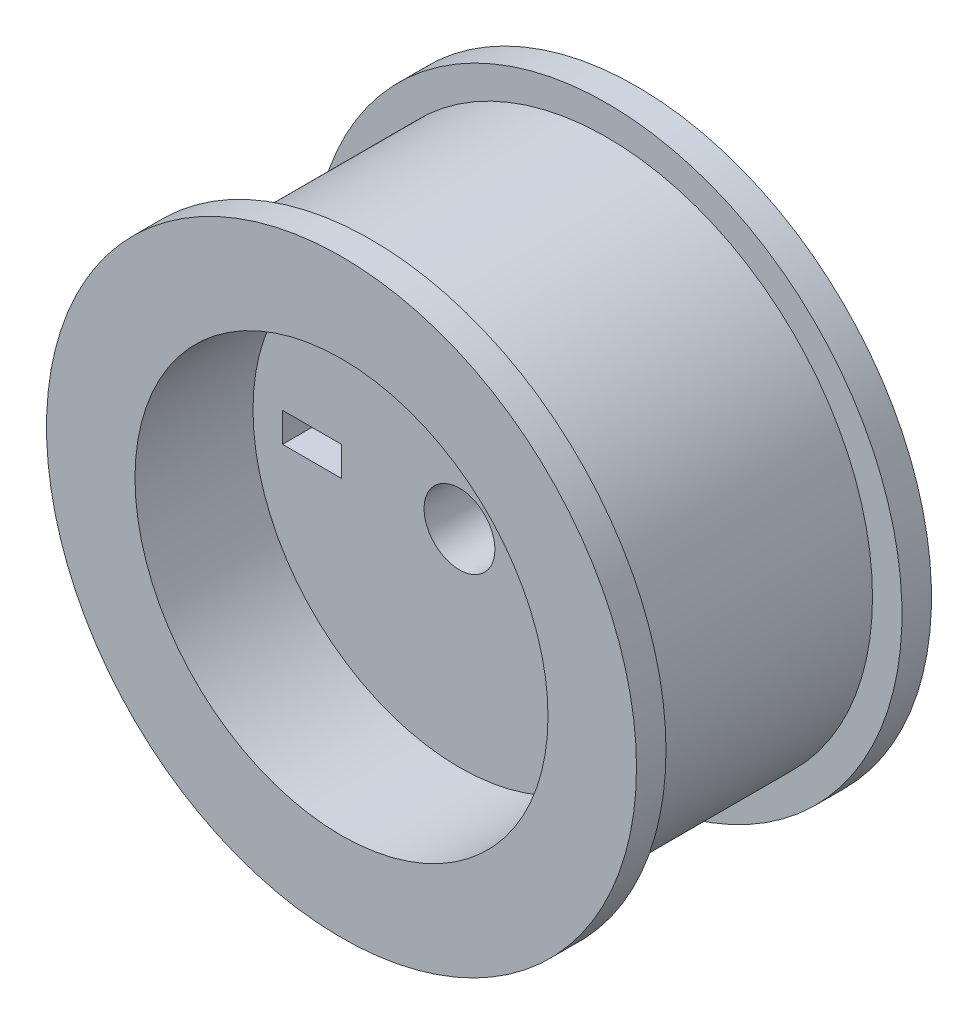
ISO-10303-21;
HEADER;
FILE_DESCRIPTION(('STEP AP214'),'2;1');
FILE_NAME('part.step','',(''),(''),'','','');
FILE_SCHEMA(('AUTOMOTIVE_DESIGN { 1 0 10303 214 1 1 1 1 }'));
ENDSEC;
DATA;
#1=APPLICATION_CONTEXT('core data for automotive mechanical design processes');
#2=APPLICATION_PROTOCOL_DEFINITION('international standard','automotive_design',2000,#1);
#3=PRODUCT_CONTEXT('',#1,'mechanical');
#4=PRODUCT('Part','Part','',(#3));
#5=PRODUCT_RELATED_PRODUCT_CATEGORY('part','',(#4));
#6=PRODUCT_DEFINITION_FORMATION('','',#4);
#7=PRODUCT_DEFINITION_CONTEXT('part definition',#1,'design');
#8=PRODUCT_DEFINITION('design','',#6,#7);
#9=PRODUCT_DEFINITION_SHAPE('','',#8);
#10=(LENGTH_UNIT() NAMED_UNIT(*) SI_UNIT(.MILLI.,.METRE.));
#11=(NAMED_UNIT(*) PLANE_ANGLE_UNIT() SI_UNIT($,.RADIAN.));
#12=(NAMED_UNIT(*) SI_UNIT($,.STERADIAN.) SOLID_ANGLE_UNIT());
#13=UNCERTAINTY_MEASURE_WITH_UNIT(LENGTH_MEASURE(1.E-05),#10,'distance_accuracy_value','');
#14=(GEOMETRIC_REPRESENTATION_CONTEXT(3) GLOBAL_UNCERTAINTY_ASSIGNED_CONTEXT((#13)) GLOBAL_UNIT_ASSIGNED_CONTEXT((#10,
#11,#12)) REPRESENTATION_CONTEXT('',''));
#15=CARTESIAN_POINT('',(0.,0.,0.));
#16=DIRECTION('',(0.,0.,1.));
#17=DIRECTION('',(1.,0.,0.));
#18=AXIS2_PLACEMENT_3D('',#15,#16,#17);
#19=CARTESIAN_POINT('',(0.,0.,40.));
#20=DIRECTION('',(0.,0.,-1.));
#21=DIRECTION('',(-1.,0.,0.));
#22=AXIS2_PLACEMENT_3D('',#19,#20,#21);
#23=CYLINDRICAL_SURFACE('',#22,45.);
#24=CARTESIAN_POINT('',(0.,0.,40.));
#25=DIRECTION('',(0.,0.,1.));
#26=DIRECTION('',(1.,0.,0.));
#27=AXIS2_PLACEMENT_3D('',#24,#25,#26);
#28=CIRCLE('',#27,45.);
#29=CARTESIAN_POINT('',(45.,0.,40.));
#30=VERTEX_POINT('',#29);
#31=EDGE_CURVE('E11',#30,#30,#28,.T.);
#32=ORIENTED_EDGE('',*,*,#31,.F.);
#33=EDGE_LOOP('',(#32));
#34=FACE_BOUND('',#33,.T.);
#35=CARTESIAN_POINT('',(0.,0.,0.));
#36=DIRECTION('',(0.,0.,1.));
#37=DIRECTION('',(1.,0.,0.));
#38=AXIS2_PLACEMENT_3D('',#35,#36,#37);
#39=CIRCLE('',#38,45.);
#40=CARTESIAN_POINT('',(45.,0.,0.));
#41=VERTEX_POINT('',#40);
#42=EDGE_CURVE('E129',#41,#41,#39,.T.);
#43=ORIENTED_EDGE('',*,*,#42,.T.);
#44=EDGE_LOOP('',(#43));
#45=FACE_BOUND('',#44,.T.);
#46=ADVANCED_FACE('F32',(#34,#45),#23,.T.);
#47=CARTESIAN_POINT('',(0.,0.,45.));
#48=DIRECTION('',(0.,0.,-1.));
#49=DIRECTION('',(-1.,0.,0.));
#50=AXIS2_PLACEMENT_3D('',#47,#48,#49);
#51=CYLINDRICAL_SURFACE('',#50,50.);
#52=CARTESIAN_POINT('',(0.,0.,45.));
#53=DIRECTION('',(0.,0.,1.));
#54=DIRECTION('',(1.,0.,0.));
#55=AXIS2_PLACEMENT_3D('',#52,#53,#54);
#56=CIRCLE('',#55,50.);
#57=CARTESIAN_POINT('',(50.,0.,45.));
#58=VERTEX_POINT('',#57);
#59=EDGE_CURVE('E40',#58,#58,#56,.T.);
#60=ORIENTED_EDGE('',*,*,#59,.F.);
#61=EDGE_LOOP('',(#60));
#62=FACE_BOUND('',#61,.T.);
#63=CARTESIAN_POINT('',(0.,0.,40.));
#64=DIRECTION('',(0.,0.,1.));
#65=DIRECTION('',(1.,0.,0.));
#66=AXIS2_PLACEMENT_3D('',#63,#64,#65);
#67=CIRCLE('',#66,50.);
#68=CARTESIAN_POINT('',(50.,0.,40.));
#69=VERTEX_POINT('',#68);
#70=EDGE_CURVE('E134',#69,#69,#67,.T.);
#71=ORIENTED_EDGE('',*,*,#70,.T.);
#72=EDGE_LOOP('',(#71));
#73=FACE_BOUND('',#72,.T.);
#74=ADVANCED_FACE('F165',(#62,#73),#51,.T.);
#75=CARTESIAN_POINT('',(0.,0.,45.));
#76=DIRECTION('',(0.,0.,1.));
#77=DIRECTION('',(1.,0.,0.));
#78=AXIS2_PLACEMENT_3D('',#75,#76,#77);
#79=PLANE('',#78);
#80=CARTESIAN_POINT('',(0.,0.,45.));
#81=DIRECTION('',(0.,0.,1.));
#82=DIRECTION('',(1.,0.,0.));
#83=AXIS2_PLACEMENT_3D('',#80,#81,#82);
#84=CIRCLE('',#83,35.);
#85=CARTESIAN_POINT('',(35.,0.,45.));
#86=VERTEX_POINT('',#85);
#87=EDGE_CURVE('E116',#86,#86,#84,.T.);
#88=ORIENTED_EDGE('',*,*,#87,.F.);
#89=EDGE_LOOP('',(#88));
#90=FACE_BOUND('',#89,.T.);
#91=ORIENTED_EDGE('',*,*,#59,.T.);
#92=EDGE_LOOP('',(#91));
#93=FACE_BOUND('',#92,.T.);
#94=ADVANCED_FACE('F159',(#90,#93),#79,.T.);
#95=CARTESIAN_POINT('',(0.,0.,40.));
#96=DIRECTION('',(0.,0.,1.));
#97=DIRECTION('',(1.,0.,0.));
#98=AXIS2_PLACEMENT_3D('',#95,#96,#97);
#99=PLANE('',#98);
#100=ORIENTED_EDGE('',*,*,#31,.T.);
#101=EDGE_LOOP('',(#100));
#102=FACE_BOUND('',#101,.T.);
#103=ORIENTED_EDGE('',*,*,#70,.F.);
#104=EDGE_LOOP('',(#103));
#105=FACE_BOUND('',#104,.T.);
#106=ADVANCED_FACE('F150',(#102,#105),#99,.F.);
#107=CARTESIAN_POINT('',(0.,0.,-5.));
#108=DIRECTION('',(0.,0.,1.));
#109=DIRECTION('',(1.,0.,0.));
#110=AXIS2_PLACEMENT_3D('',#107,#108,#109);
#111=CYLINDRICAL_SURFACE('',#110,50.);
#112=CARTESIAN_POINT('',(0.,0.,-5.));
#113=DIRECTION('',(0.,0.,-1.));
#114=DIRECTION('',(-1.,0.,0.));
#115=AXIS2_PLACEMENT_3D('',#112,#113,#114);
#116=CIRCLE('',#115,50.);
#117=CARTESIAN_POINT('',(-50.,0.,-5.));
#118=VERTEX_POINT('',#117);
#119=EDGE_CURVE('E126',#118,#118,#116,.T.);
#120=ORIENTED_EDGE('',*,*,#119,.F.);
#121=EDGE_LOOP('',(#120));
#122=FACE_BOUND('',#121,.T.);
#123=CARTESIAN_POINT('',(0.,0.,0.));
#124=DIRECTION('',(0.,0.,-1.));
#125=DIRECTION('',(-1.,0.,0.));
#126=AXIS2_PLACEMENT_3D('',#123,#124,#125);
#127=CIRCLE('',#126,50.);
#128=CARTESIAN_POINT('',(-50.,0.,0.));
#129=VERTEX_POINT('',#128);
#130=EDGE_CURVE('E123',#129,#129,#127,.T.);
#131=ORIENTED_EDGE('',*,*,#130,.T.);
#132=EDGE_LOOP('',(#131));
#133=FACE_BOUND('',#132,.T.);
#134=ADVANCED_FACE('F148',(#122,#133),#111,.T.);
#135=CARTESIAN_POINT('',(0.,0.,-5.));
#136=DIRECTION('',(0.,0.,-1.));
#137=DIRECTION('',(-1.,0.,0.));
#138=AXIS2_PLACEMENT_3D('',#135,#136,#137);
#139=PLANE('',#138);
#140=CARTESIAN_POINT('',(0.,0.,-5.));
#141=DIRECTION('',(0.,0.,-1.));
#142=DIRECTION('',(-1.,0.,0.));
#143=AXIS2_PLACEMENT_3D('',#140,#141,#142);
#144=CIRCLE('',#143,35.);
#145=CARTESIAN_POINT('',(-35.,0.,-5.));
#146=VERTEX_POINT('',#145);
#147=EDGE_CURVE('E117',#146,#146,#144,.T.);
#148=ORIENTED_EDGE('',*,*,#147,.F.);
#149=EDGE_LOOP('',(#148));
#150=FACE_BOUND('',#149,.T.);
#151=ORIENTED_EDGE('',*,*,#119,.T.);
#152=EDGE_LOOP('',(#151));
#153=FACE_BOUND('',#152,.T.);
#154=ADVANCED_FACE('F144',(#150,#153),#139,.T.);
#155=CARTESIAN_POINT('',(0.,0.,0.));
#156=DIRECTION('',(0.,0.,-1.));
#157=DIRECTION('',(-1.,0.,0.));
#158=AXIS2_PLACEMENT_3D('',#155,#156,#157);
#159=PLANE('',#158);
#160=ORIENTED_EDGE('',*,*,#42,.F.);
#161=EDGE_LOOP('',(#160));
#162=FACE_BOUND('',#161,.T.);
#163=ORIENTED_EDGE('',*,*,#130,.F.);
#164=EDGE_LOOP('',(#163));
#165=FACE_BOUND('',#164,.T.);
#166=ADVANCED_FACE('F140',(#162,#165),#159,.F.);
#167=CARTESIAN_POINT('',(0.,0.,25.));
#168=DIRECTION('',(0.,0.,1.));
#169=DIRECTION('',(1.,0.,0.));
#170=AXIS2_PLACEMENT_3D('',#167,#168,#169);
#171=CYLINDRICAL_SURFACE('',#170,35.);
#172=CARTESIAN_POINT('',(0.,0.,25.));
#173=DIRECTION('',(0.,0.,1.));
#174=DIRECTION('',(1.,0.,0.));
#175=AXIS2_PLACEMENT_3D('',#172,#173,#174);
#176=CIRCLE('',#175,35.);
#177=CARTESIAN_POINT('',(35.,0.,25.));
#178=VERTEX_POINT('',#177);
#179=EDGE_CURVE('E120',#178,#178,#176,.T.);
#180=ORIENTED_EDGE('',*,*,#179,.F.);
#181=EDGE_LOOP('',(#180));
#182=FACE_BOUND('',#181,.T.);
#183=ORIENTED_EDGE('',*,*,#87,.T.);
#184=EDGE_LOOP('',(#183));
#185=FACE_BOUND('',#184,.T.);
#186=ADVANCED_FACE('F143',(#182,#185),#171,.F.);
#187=CARTESIAN_POINT('',(0.,0.,25.));
#188=DIRECTION('',(0.,0.,1.));
#189=DIRECTION('',(1.,0.,0.));
#190=AXIS2_PLACEMENT_3D('',#187,#188,#189);
#191=PLANE('',#190);
#192=DIRECTION('',(0.,1.,0.));
#193=VECTOR('',#192,1.);
#194=CARTESIAN_POINT('',(-20.,-0.0730995796232158,25.));
#195=LINE('',#194,#193);
#196=CARTESIAN_POINT('',(-20.,-2.57309957962322,25.));
#197=VERTEX_POINT('',#196);
#198=CARTESIAN_POINT('',(-20.,2.42690042037678,25.));
#199=VERTEX_POINT('',#198);
#200=EDGE_CURVE('E78',#197,#199,#195,.T.);
#201=ORIENTED_EDGE('',*,*,#200,.F.);
#202=DIRECTION('',(1.,0.,0.));
#203=VECTOR('',#202,1.);
#204=CARTESIAN_POINT('',(-20.,-2.57309957962322,25.));
#205=LINE('',#204,#203);
#206=CARTESIAN_POINT('',(-30.,-2.57309957962322,25.));
#207=VERTEX_POINT('',#206);
#208=EDGE_CURVE('E93',#207,#197,#205,.T.);
#209=ORIENTED_EDGE('',*,*,#208,.F.);
#210=DIRECTION('',(0.,-1.,0.));
#211=VECTOR('',#210,1.);
#212=CARTESIAN_POINT('',(-30.,-0.073099579623217,25.));
#213=LINE('',#212,#211);
#214=CARTESIAN_POINT('',(-30.,2.42690042037678,25.));
#215=VERTEX_POINT('',#214);
#216=EDGE_CURVE('E100',#215,#207,#213,.T.);
#217=ORIENTED_EDGE('',*,*,#216,.F.);
#218=DIRECTION('',(-1.,0.,0.));
#219=VECTOR('',#218,1.);
#220=CARTESIAN_POINT('',(-20.,2.42690042037678,25.));
#221=LINE('',#220,#219);
#222=EDGE_CURVE('E98',#199,#215,#221,.T.);
#223=ORIENTED_EDGE('',*,*,#222,.F.);
#224=EDGE_LOOP('',(#201,#209,#217,#223));
#225=FACE_BOUND('',#224,.T.);
#226=CARTESIAN_POINT('',(0.,0.,25.));
#227=DIRECTION('',(0.,0.,1.));
#228=DIRECTION('',(1.,0.,0.));
#229=AXIS2_PLACEMENT_3D('',#226,#227,#228);
#230=CIRCLE('',#229,6.);
#231=CARTESIAN_POINT('',(6.,0.,25.));
#232=VERTEX_POINT('',#231);
#233=EDGE_CURVE('E107',#232,#232,#230,.T.);
#234=ORIENTED_EDGE('',*,*,#233,.F.);
#235=EDGE_LOOP('',(#234));
#236=FACE_BOUND('',#235,.T.);
#237=ORIENTED_EDGE('',*,*,#179,.T.);
#238=EDGE_LOOP('',(#237));
#239=FACE_BOUND('',#238,.T.);
#240=ADVANCED_FACE('F186',(#225,#236,#239),#191,.T.);
#241=CARTESIAN_POINT('',(0.,0.,15.));
#242=DIRECTION('',(0.,0.,-1.));
#243=DIRECTION('',(-1.,0.,0.));
#244=AXIS2_PLACEMENT_3D('',#241,#242,#243);
#245=CYLINDRICAL_SURFACE('',#244,35.);
#246=CARTESIAN_POINT('',(0.,0.,15.));
#247=DIRECTION('',(0.,0.,-1.));
#248=DIRECTION('',(-1.,0.,0.));
#249=AXIS2_PLACEMENT_3D('',#246,#247,#248);
#250=CIRCLE('',#249,35.);
#251=CARTESIAN_POINT('',(-35.,0.,15.));
#252=VERTEX_POINT('',#251);
#253=EDGE_CURVE('E113',#252,#252,#250,.T.);
#254=ORIENTED_EDGE('',*,*,#253,.F.);
#255=EDGE_LOOP('',(#254));
#256=FACE_BOUND('',#255,.T.);
#257=ORIENTED_EDGE('',*,*,#147,.T.);
#258=EDGE_LOOP('',(#257));
#259=FACE_BOUND('',#258,.T.);
#260=ADVANCED_FACE('F192',(#256,#259),#245,.F.);
#261=CARTESIAN_POINT('',(0.,0.,15.));
#262=DIRECTION('',(0.,0.,-1.));
#263=DIRECTION('',(-1.,0.,0.));
#264=AXIS2_PLACEMENT_3D('',#261,#262,#263);
#265=PLANE('',#264);
#266=DIRECTION('',(0.,1.,0.));
#267=VECTOR('',#266,1.);
#268=CARTESIAN_POINT('',(-20.,-0.0730995796232158,15.));
#269=LINE('',#268,#267);
#270=CARTESIAN_POINT('',(-20.,-2.57309957962322,15.));
#271=VERTEX_POINT('',#270);
#272=CARTESIAN_POINT('',(-20.,2.42690042037678,15.));
#273=VERTEX_POINT('',#272);
#274=EDGE_CURVE('E75',#271,#273,#269,.T.);
#275=ORIENTED_EDGE('',*,*,#274,.T.);
#276=DIRECTION('',(-1.,0.,0.));
#277=VECTOR('',#276,1.);
#278=CARTESIAN_POINT('',(-20.,2.42690042037678,15.));
#279=LINE('',#278,#277);
#280=CARTESIAN_POINT('',(-30.,2.42690042037678,15.));
#281=VERTEX_POINT('',#280);
#282=EDGE_CURVE('E84',#273,#281,#279,.T.);
#283=ORIENTED_EDGE('',*,*,#282,.T.);
#284=DIRECTION('',(0.,-1.,0.));
#285=VECTOR('',#284,1.);
#286=CARTESIAN_POINT('',(-30.,-0.073099579623217,15.));
#287=LINE('',#286,#285);
#288=CARTESIAN_POINT('',(-30.,-2.57309957962322,15.));
#289=VERTEX_POINT('',#288);
#290=EDGE_CURVE('E56',#281,#289,#287,.T.);
#291=ORIENTED_EDGE('',*,*,#290,.T.);
#292=DIRECTION('',(1.,0.,0.));
#293=VECTOR('',#292,1.);
#294=CARTESIAN_POINT('',(-20.,-2.57309957962322,15.));
#295=LINE('',#294,#293);
#296=EDGE_CURVE('E81',#289,#271,#295,.T.);
#297=ORIENTED_EDGE('',*,*,#296,.T.);
#298=EDGE_LOOP('',(#275,#283,#291,#297));
#299=FACE_BOUND('',#298,.T.);
#300=CARTESIAN_POINT('',(0.,0.,15.));
#301=DIRECTION('',(0.,0.,-1.));
#302=DIRECTION('',(-1.,0.,0.));
#303=AXIS2_PLACEMENT_3D('',#300,#301,#302);
#304=CIRCLE('',#303,6.);
#305=CARTESIAN_POINT('',(-6.,0.,15.));
#306=VERTEX_POINT('',#305);
#307=EDGE_CURVE('E35',#306,#306,#304,.T.);
#308=ORIENTED_EDGE('',*,*,#307,.F.);
#309=EDGE_LOOP('',(#308));
#310=FACE_BOUND('',#309,.T.);
#311=ORIENTED_EDGE('',*,*,#253,.T.);
#312=EDGE_LOOP('',(#311));
#313=FACE_BOUND('',#312,.T.);
#314=ADVANCED_FACE('F89',(#299,#310,#313),#265,.T.);
#315=CARTESIAN_POINT('',(0.,0.,5.));
#316=DIRECTION('',(0.,0.,1.));
#317=DIRECTION('',(1.,0.,0.));
#318=AXIS2_PLACEMENT_3D('',#315,#316,#317);
#319=CYLINDRICAL_SURFACE('',#318,6.);
#320=ORIENTED_EDGE('',*,*,#307,.T.);
#321=EDGE_LOOP('',(#320));
#322=FACE_BOUND('',#321,.T.);
#323=ORIENTED_EDGE('',*,*,#233,.T.);
#324=EDGE_LOOP('',(#323));
#325=FACE_BOUND('',#324,.T.);
#326=ADVANCED_FACE('F202',(#322,#325),#319,.F.);
#327=CARTESIAN_POINT('',(-20.,-0.0730995796232158,15.));
#328=DIRECTION('',(1.,0.,0.));
#329=DIRECTION('',(0.,0.,-1.));
#330=AXIS2_PLACEMENT_3D('',#327,#328,#329);
#331=PLANE('',#330);
#332=ORIENTED_EDGE('',*,*,#200,.T.);
#333=DIRECTION('',(0.,0.,1.));
#334=VECTOR('',#333,1.);
#335=CARTESIAN_POINT('',(-20.,2.42690042037678,15.));
#336=LINE('',#335,#334);
#337=EDGE_CURVE('E48',#273,#199,#336,.T.);
#338=ORIENTED_EDGE('',*,*,#337,.F.);
#339=ORIENTED_EDGE('',*,*,#274,.F.);
#340=DIRECTION('',(0.,0.,1.));
#341=VECTOR('',#340,1.);
#342=CARTESIAN_POINT('',(-20.,-2.57309957962322,15.));
#343=LINE('',#342,#341);
#344=EDGE_CURVE('E105',#271,#197,#343,.T.);
#345=ORIENTED_EDGE('',*,*,#344,.T.);
#346=EDGE_LOOP('',(#332,#338,#339,#345));
#347=FACE_BOUND('',#346,.T.);
#348=ADVANCED_FACE('F73',(#347),#331,.F.);
#349=CARTESIAN_POINT('',(-20.,-2.57309957962322,15.));
#350=DIRECTION('',(0.,-1.,0.));
#351=DIRECTION('',(1.,0.,0.));
#352=AXIS2_PLACEMENT_3D('',#349,#350,#351);
#353=PLANE('',#352);
#354=ORIENTED_EDGE('',*,*,#208,.T.);
#355=ORIENTED_EDGE('',*,*,#344,.F.);
#356=ORIENTED_EDGE('',*,*,#296,.F.);
#357=DIRECTION('',(0.,0.,1.));
#358=VECTOR('',#357,1.);
#359=CARTESIAN_POINT('',(-30.,-2.57309957962322,15.));
#360=LINE('',#359,#358);
#361=EDGE_CURVE('E108',#289,#207,#360,.T.);
#362=ORIENTED_EDGE('',*,*,#361,.T.);
#363=EDGE_LOOP('',(#354,#355,#356,#362));
#364=FACE_BOUND('',#363,.T.);
#365=ADVANCED_FACE('F211',(#364),#353,.F.);
#366=CARTESIAN_POINT('',(-30.,-0.073099579623217,15.));
#367=DIRECTION('',(-1.,0.,0.));
#368=DIRECTION('',(0.,0.,1.));
#369=AXIS2_PLACEMENT_3D('',#366,#367,#368);
#370=PLANE('',#369);
#371=ORIENTED_EDGE('',*,*,#216,.T.);
#372=ORIENTED_EDGE('',*,*,#361,.F.);
#373=ORIENTED_EDGE('',*,*,#290,.F.);
#374=DIRECTION('',(0.,0.,1.));
#375=VECTOR('',#374,1.);
#376=CARTESIAN_POINT('',(-30.,2.42690042037678,15.));
#377=LINE('',#376,#375);
#378=EDGE_CURVE('E80',#281,#215,#377,.T.);
#379=ORIENTED_EDGE('',*,*,#378,.T.);
#380=EDGE_LOOP('',(#371,#372,#373,#379));
#381=FACE_BOUND('',#380,.T.);
#382=ADVANCED_FACE('F208',(#381),#370,.F.);
#383=CARTESIAN_POINT('',(-20.,2.42690042037678,15.));
#384=DIRECTION('',(0.,1.,0.));
#385=DIRECTION('',(-1.,0.,0.));
#386=AXIS2_PLACEMENT_3D('',#383,#384,#385);
#387=PLANE('',#386);
#388=ORIENTED_EDGE('',*,*,#222,.T.);
#389=ORIENTED_EDGE('',*,*,#378,.F.);
#390=ORIENTED_EDGE('',*,*,#282,.F.);
#391=ORIENTED_EDGE('',*,*,#337,.T.);
#392=EDGE_LOOP('',(#388,#389,#390,#391));
#393=FACE_BOUND('',#392,.T.);
#394=ADVANCED_FACE('F85',(#393),#387,.F.);
#395=CLOSED_SHELL('',(#46,#74,#94,#106,#134,#154,#166,#186,#240,#260,#314,#326,#348,#365,#382,#394));
#396=MANIFOLD_SOLID_BREP('B2',#395);
#397=ADVANCED_BREP_SHAPE_REPRESENTATION('',(#18,#396),#14);
#398=SHAPE_DEFINITION_REPRESENTATION(#9,#397);
ENDSEC;
END-ISO-10303-21;
